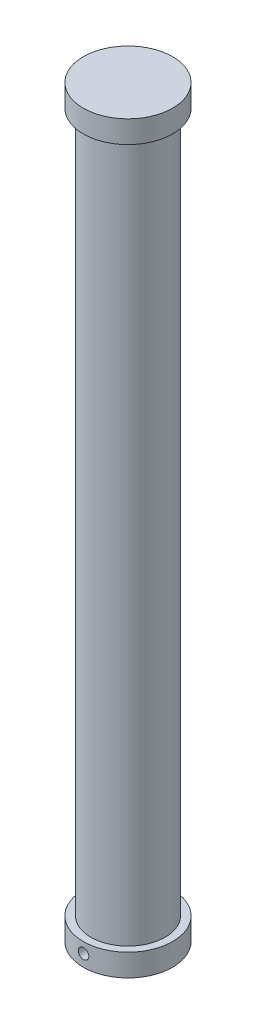
ISO-10303-21;
HEADER;
FILE_DESCRIPTION(('STEP AP214'),'2;1');
FILE_NAME('part.step','',(''),(''),'','','');
FILE_SCHEMA(('AUTOMOTIVE_DESIGN { 1 0 10303 214 1 1 1 1 }'));
ENDSEC;
DATA;
#1=APPLICATION_CONTEXT('core data for automotive mechanical design processes');
#2=APPLICATION_PROTOCOL_DEFINITION('international standard','automotive_design',2000,#1);
#3=PRODUCT_CONTEXT('',#1,'mechanical');
#4=PRODUCT('Part','Part','',(#3));
#5=PRODUCT_RELATED_PRODUCT_CATEGORY('part','',(#4));
#6=PRODUCT_DEFINITION_FORMATION('','',#4);
#7=PRODUCT_DEFINITION_CONTEXT('part definition',#1,'design');
#8=PRODUCT_DEFINITION('design','',#6,#7);
#9=PRODUCT_DEFINITION_SHAPE('','',#8);
#10=(LENGTH_UNIT() NAMED_UNIT(*) SI_UNIT(.MILLI.,.METRE.));
#11=(NAMED_UNIT(*) PLANE_ANGLE_UNIT() SI_UNIT($,.RADIAN.));
#12=(NAMED_UNIT(*) SI_UNIT($,.STERADIAN.) SOLID_ANGLE_UNIT());
#13=UNCERTAINTY_MEASURE_WITH_UNIT(LENGTH_MEASURE(1.E-05),#10,'distance_accuracy_value','');
#14=(GEOMETRIC_REPRESENTATION_CONTEXT(3) GLOBAL_UNCERTAINTY_ASSIGNED_CONTEXT((#13)) GLOBAL_UNIT_ASSIGNED_CONTEXT((#10,
#11,#12)) REPRESENTATION_CONTEXT('',''));
#15=CARTESIAN_POINT('',(0.,0.,0.));
#16=DIRECTION('',(0.,0.,1.));
#17=DIRECTION('',(1.,0.,0.));
#18=AXIS2_PLACEMENT_3D('',#15,#16,#17);
#19=CARTESIAN_POINT('',(0.,50.,0.));
#20=DIRECTION('',(0.,1.,0.));
#21=DIRECTION('',(-1.,0.,0.));
#22=AXIS2_PLACEMENT_3D('',#19,#20,#21);
#23=CYLINDRICAL_SURFACE('',#22,3.);
#24=CARTESIAN_POINT('',(0.,1.5,0.));
#25=DIRECTION('',(0.,1.,0.));
#26=DIRECTION('',(-1.,0.,0.));
#27=AXIS2_PLACEMENT_3D('',#24,#25,#26);
#28=CIRCLE('',#27,3.);
#29=CARTESIAN_POINT('',(-3.,1.5,0.));
#30=VERTEX_POINT('',#29);
#31=EDGE_CURVE('E47',#30,#30,#28,.T.);
#32=ORIENTED_EDGE('',*,*,#31,.F.);
#33=EDGE_LOOP('',(#32));
#34=FACE_BOUND('',#33,.T.);
#35=CARTESIAN_POINT('',(0.,0.,0.));
#36=DIRECTION('',(0.,1.,0.));
#37=DIRECTION('',(-1.,0.,0.));
#38=AXIS2_PLACEMENT_3D('',#35,#36,#37);
#39=CIRCLE('',#38,3.);
#40=CARTESIAN_POINT('',(-3.,0.,0.));
#41=VERTEX_POINT('',#40);
#42=EDGE_CURVE('E10',#41,#41,#39,.T.);
#43=ORIENTED_EDGE('',*,*,#42,.T.);
#44=EDGE_LOOP('',(#43));
#45=FACE_BOUND('',#44,.T.);
#46=CARTESIAN_POINT('',(-0.35,0.802923522551414,-2.97951338308792));
#47=CARTESIAN_POINT('',(-0.349999161223445,0.822511265245883,-2.97951364773673));
#48=CARTESIAN_POINT('',(-0.348350113747884,0.842111504549914,-2.97970862625163));
#49=CARTESIAN_POINT('',(-0.341797393838866,0.880767241574152,-2.98046724537003));
#50=CARTESIAN_POINT('',(-0.336890253973869,0.899822136349489,-2.98103127873162));
#51=CARTESIAN_POINT('',(-0.32396734183745,0.936821872343707,-2.9824632704724));
#52=CARTESIAN_POINT('',(-0.315953598732255,0.954767429304936,-2.98333103042808));
#53=CARTESIAN_POINT('',(-0.297049153620366,0.989055392431769,-2.98527245998851));
#54=CARTESIAN_POINT('',(-0.286158971804845,1.0053980877357,-2.98634609235253));
#55=CARTESIAN_POINT('',(-0.261753638808667,1.03609993948238,-2.98858418089488));
#56=CARTESIAN_POINT('',(-0.248227234592529,1.0504501242645,-2.98974901314468));
#57=CARTESIAN_POINT('',(-0.218957598403572,1.07668218997642,-2.99203486226237));
#58=CARTESIAN_POINT('',(-0.203214259440149,1.0885639517101,-2.99315587701226));
#59=CARTESIAN_POINT('',(-0.169901694948282,1.1095537136471,-2.99523159244975));
#60=CARTESIAN_POINT('',(-0.152327355232392,1.11865364944094,-2.99618580622701));
#61=CARTESIAN_POINT('',(-0.115886983849122,1.13376981675468,-2.99781628489831));
#62=CARTESIAN_POINT('',(-0.0970209942369041,1.13978614862036,-2.99849255883684));
#63=CARTESIAN_POINT('',(-0.0586243024747181,1.14853767246088,-2.99948831400881));
#64=CARTESIAN_POINT('',(-0.0390970309315914,1.15128772918662,-2.99980941118195));
#65=CARTESIAN_POINT('',(0.000144327639085537,1.15347468054051,-3.00006414472858));
#66=CARTESIAN_POINT('',(0.0198584081886424,1.15291168963881,-2.99999779448888));
#67=CARTESIAN_POINT('',(0.0588127205606732,1.14850049431022,-2.99948642176044));
#68=CARTESIAN_POINT('',(0.078054790174137,1.14466827543935,-2.99904324189153));
#69=CARTESIAN_POINT('',(0.115620799572831,1.13385236505493,-2.99783009060348));
#70=CARTESIAN_POINT('',(0.133944723826639,1.12686862024989,-2.99706011365831));
#71=CARTESIAN_POINT('',(0.169204104429469,1.10993071315375,-2.99527672528236));
#72=CARTESIAN_POINT('',(0.186136180813597,1.09996957733615,-2.99426274345197));
#73=CARTESIAN_POINT('',(0.218094351884489,1.0773647173508,-2.99210490952607));
#74=CARTESIAN_POINT('',(0.233120370366558,1.06472088598216,-2.99096105224158));
#75=CARTESIAN_POINT('',(0.260933706419429,1.03701988016374,-2.98866356651889));
#76=CARTESIAN_POINT('',(0.273707160059187,1.02194878299298,-2.98750992045636));
#77=CARTESIAN_POINT('',(0.296545173750231,0.989869044044865,-2.98532962837825));
#78=CARTESIAN_POINT('',(0.30660972716092,0.97286039751794,-2.984302982674));
#79=CARTESIAN_POINT('',(0.323744728388877,0.937376628363879,-2.98249291300022));
#80=CARTESIAN_POINT('',(0.330814156749145,0.918901008956771,-2.98170957186894));
#81=CARTESIAN_POINT('',(0.341746413810154,0.881013753533747,-2.9804764600808));
#82=CARTESIAN_POINT('',(0.34560937652905,0.861602156674039,-2.98002667548262));
#83=CARTESIAN_POINT('',(0.350000875403439,0.822516152158018,-2.97951411022731));
#84=CARTESIAN_POINT('',(0.3505488810829,0.802843960474129,-2.97944906992621));
#85=CARTESIAN_POINT('',(0.34834619521672,0.763688045208938,-2.97970738657806));
#86=CARTESIAN_POINT('',(0.345595564717283,0.744204318146542,-2.98003073634326));
#87=CARTESIAN_POINT('',(0.336890043016935,0.706036177170415,-2.98102734060544));
#88=CARTESIAN_POINT('',(0.330944499968318,0.687349602147369,-2.98169957409112));
#89=CARTESIAN_POINT('',(0.316027519482387,0.651238755445137,-2.98331737529937));
#90=CARTESIAN_POINT('',(0.307055988799645,0.63381452268497,-2.98426295144483));
#91=CARTESIAN_POINT('',(0.286293509804678,0.600634648660672,-2.98632633027885));
#92=CARTESIAN_POINT('',(0.274489745840013,0.584887075787833,-2.98744490736213));
#93=CARTESIAN_POINT('',(0.248416071978394,0.555589680519816,-2.98972578669665));
#94=CARTESIAN_POINT('',(0.234146078719241,0.542039932444388,-2.99088809042489));
#95=CARTESIAN_POINT('',(0.203460176847881,0.517454868917279,-2.99313236127279));
#96=CARTESIAN_POINT('',(0.187034009095524,0.506432314087539,-2.99421390286487));
#97=CARTESIAN_POINT('',(0.152552205539145,0.487302647462873,-2.99616848918425));
#98=CARTESIAN_POINT('',(0.134496598913617,0.47919548347476,-2.99704153764403));
#99=CARTESIAN_POINT('',(0.0973116154809955,0.4661480006956,-2.99847886971759));
#100=CARTESIAN_POINT('',(0.0781848972498101,0.46120018876961,-2.99904388343781));
#101=CARTESIAN_POINT('',(0.0393651847196159,0.454587454374519,-2.99980450423336));
#102=CARTESIAN_POINT('',(0.0196722125336349,0.452922403885057,-3.00000012571416));
#103=CARTESIAN_POINT('',(-0.0195961394516416,0.452924635764175,-2.99999987489361));
#104=CARTESIAN_POINT('',(-0.0391715233378456,0.454572194990443,-2.99980631973382));
#105=CARTESIAN_POINT('',(-0.0777652537998503,0.461111253453813,-2.99905405455136));
#106=CARTESIAN_POINT('',(-0.0967836004336522,0.466002752353142,-2.99849534456673));
#107=CARTESIAN_POINT('',(-0.133721665576691,0.478884897358325,-2.99707529734934));
#108=CARTESIAN_POINT('',(-0.15164167203335,0.486874727127817,-2.99621403983627));
#109=CARTESIAN_POINT('',(-0.185889569912979,0.505724683890308,-2.9942844920793));
#110=CARTESIAN_POINT('',(-0.202217452374167,0.516584827038513,-2.99321620067014));
#111=CARTESIAN_POINT('',(-0.232918528861254,0.540940514692901,-2.9909843884025));
#112=CARTESIAN_POINT('',(-0.247280031018242,0.554450751193688,-2.98982035868271));
#113=CARTESIAN_POINT('',(-0.27354008300556,0.583692959704031,-2.98753243407508));
#114=CARTESIAN_POINT('',(-0.285438046216235,0.599425459383666,-2.98640854879906));
#115=CARTESIAN_POINT('',(-0.306466883718857,0.632725774617497,-2.9843241162639));
#116=CARTESIAN_POINT('',(-0.315588277683846,0.650299608728324,-2.98336413342509));
#117=CARTESIAN_POINT('',(-0.330737816927518,0.686730433917195,-2.98172283839803));
#118=CARTESIAN_POINT('',(-0.336769371254114,0.705585984725701,-2.98104121925781));
#119=CARTESIAN_POINT('',(-0.344102374273725,0.737606032663178,-2.9802016331342));
#120=CARTESIAN_POINT('',(-0.346310860792777,0.750567511298079,-2.97994480127126));
#121=CARTESIAN_POINT('',(-0.349259950284348,0.776658628330768,-2.97960058804514));
#122=CARTESIAN_POINT('',(-0.350000562471424,0.789788265672422,-2.97951320561825));
#123=CARTESIAN_POINT('',(-0.35,0.802923522551414,-2.97951338308792));
#124=B_SPLINE_CURVE_WITH_KNOTS('',3,(#46,#47,#48,#49,#50,#51,#52,#53,#54,#55,#56,#57,#58,#59,
#60,#61,#62,#63,#64,#65,#66,#67,#68,#69,#70,#71,#72,#73,#74,#75,#76,#77,#78,#79,#80,#81,#82,#83,
#84,#85,#86,#87,#88,#89,#90,#91,#92,#93,#94,#95,#96,#97,#98,#99,#100,#101,#102,#103,#104,#105,
#106,#107,#108,#109,#110,#111,#112,#113,#114,#115,#116,#117,#118,#119,#120,#121,#122,#123),
.UNSPECIFIED.,.T.,.F.,(4,2,2,2,2,2,2,2,2,2,2,2,2,2,2,2,2,2,2,2,2,2,2,2,2,2,2,2,2,2,2,2,2,2,2,2,
2,2,4),(0.,0.0587152493703068,0.117493086943228,0.17623259661377,0.234961490769293,
0.293946795448501,0.352934947770214,0.412092517407894,0.471248161834173,0.530133545789995,
0.589016895190498,0.647613961990353,0.706212019688542,0.764948413445981,0.823687154760208,
0.882775675902613,0.941864341893256,1.00097310389078,1.06007939524087,1.11883820170337,
1.1775959207629,1.23618264644775,1.29477117764011,1.35362999037985,1.41249079302379,
1.47164256055315,1.53079326905711,1.58980316170827,1.64881075305993,1.70746805603357,
1.76612535289952,1.82476720545446,1.8834093880749,1.94238636941037,2.00137737827701,
2.0605676035464,2.11969238229147,2.15906622626694,2.198439823073),.UNSPECIFIED.);
#125=CARTESIAN_POINT('',(-0.35,0.802923522551414,-2.97951338308792));
#126=VERTEX_POINT('',#125);
#127=EDGE_CURVE('E55',#126,#126,#124,.T.);
#128=ORIENTED_EDGE('',*,*,#127,.F.);
#129=EDGE_LOOP('',(#128));
#130=FACE_BOUND('',#129,.T.);
#131=CARTESIAN_POINT('',(-0.35,0.802923522551414,2.97951338308792));
#132=CARTESIAN_POINT('',(-0.349999161223445,0.783335779856945,2.97951364773673));
#133=CARTESIAN_POINT('',(-0.348350113747885,0.763735540552914,2.97970862625163));
#134=CARTESIAN_POINT('',(-0.341797393838866,0.725079803528676,2.98046724537003));
#135=CARTESIAN_POINT('',(-0.336890253973869,0.706024908753339,2.98103127873162));
#136=CARTESIAN_POINT('',(-0.323967341837449,0.669025172759121,2.9824632704724));
#137=CARTESIAN_POINT('',(-0.315953598732255,0.651079615797892,2.98333103042808));
#138=CARTESIAN_POINT('',(-0.297049153620366,0.616791652671059,2.98527245998851));
#139=CARTESIAN_POINT('',(-0.286158971804845,0.600448957367127,2.98634609235253));
#140=CARTESIAN_POINT('',(-0.261753638808667,0.569747105620448,2.98858418089488));
#141=CARTESIAN_POINT('',(-0.248227234592529,0.555396920838329,2.98974901314468));
#142=CARTESIAN_POINT('',(-0.218957598403572,0.529164855126409,2.99203486226237));
#143=CARTESIAN_POINT('',(-0.203214259440149,0.517283093392732,2.99315587701226));
#144=CARTESIAN_POINT('',(-0.169901694948282,0.49629333145573,2.99523159244975));
#145=CARTESIAN_POINT('',(-0.152327355232392,0.487193395661892,2.99618580622701));
#146=CARTESIAN_POINT('',(-0.115886983849122,0.47207722834815,2.99781628489831));
#147=CARTESIAN_POINT('',(-0.0970209942369042,0.466060896482467,2.99849255883684));
#148=CARTESIAN_POINT('',(-0.0586243024747181,0.457309372641943,2.99948831400881));
#149=CARTESIAN_POINT('',(-0.0390970309315915,0.454559315916204,2.99980941118195));
#150=CARTESIAN_POINT('',(0.00014432763908548,0.452372364562314,3.00006414472858));
#151=CARTESIAN_POINT('',(0.0198584081886424,0.452935355464021,2.99999779448888));
#152=CARTESIAN_POINT('',(0.0588127205606732,0.457346550792605,2.99948642176044));
#153=CARTESIAN_POINT('',(0.0780547901741371,0.461178769663479,2.99904324189153));
#154=CARTESIAN_POINT('',(0.115620799572831,0.471994680047903,2.99783009060348));
#155=CARTESIAN_POINT('',(0.133944723826639,0.478978424852939,2.99706011365831));
#156=CARTESIAN_POINT('',(0.169204104429469,0.495916331949074,2.99527672528236));
#157=CARTESIAN_POINT('',(0.186136180813597,0.505877467766676,2.99426274345197));
#158=CARTESIAN_POINT('',(0.218094351884489,0.528482327752029,2.99210490952607));
#159=CARTESIAN_POINT('',(0.233120370366558,0.541126159120673,2.99096105224158));
#160=CARTESIAN_POINT('',(0.260933706419429,0.568827164939088,2.98866356651889));
#161=CARTESIAN_POINT('',(0.273707160059187,0.583898262109843,2.98750992045636));
#162=CARTESIAN_POINT('',(0.296545173750231,0.615978001057963,2.98532962837825));
#163=CARTESIAN_POINT('',(0.30660972716092,0.632986647584888,2.984302982674));
#164=CARTESIAN_POINT('',(0.323744728388877,0.668470416738949,2.98249291300022));
#165=CARTESIAN_POINT('',(0.330814156749145,0.686946036146057,2.98170957186894));
#166=CARTESIAN_POINT('',(0.341746413810154,0.724833291569081,2.9804764600808));
#167=CARTESIAN_POINT('',(0.34560937652905,0.744244888428789,2.98002667548262));
#168=CARTESIAN_POINT('',(0.350000875403439,0.783330892944811,2.97951411022731));
#169=CARTESIAN_POINT('',(0.3505488810829,0.803003084628699,2.97944906992621));
#170=CARTESIAN_POINT('',(0.34834619521672,0.84215899989389,2.97970738657806));
#171=CARTESIAN_POINT('',(0.345595564717283,0.861642726956286,2.98003073634326));
#172=CARTESIAN_POINT('',(0.336890043016935,0.899810867932414,2.98102734060544));
#173=CARTESIAN_POINT('',(0.330944499968318,0.91849744295546,2.98169957409112));
#174=CARTESIAN_POINT('',(0.316027519482387,0.954608289657692,2.98331737529937));
#175=CARTESIAN_POINT('',(0.307055988799645,0.972032522417858,2.98426295144483));
#176=CARTESIAN_POINT('',(0.286293509804678,1.00521239644216,2.98632633027885));
#177=CARTESIAN_POINT('',(0.274489745840013,1.02095996931499,2.98744490736213));
#178=CARTESIAN_POINT('',(0.248416071978394,1.05025736458301,2.98972578669665));
#179=CARTESIAN_POINT('',(0.234146078719241,1.06380711265844,2.99088809042489));
#180=CARTESIAN_POINT('',(0.203460176847881,1.08839217618555,2.99313236127279));
#181=CARTESIAN_POINT('',(0.187034009095524,1.09941473101529,2.99421390286487));
#182=CARTESIAN_POINT('',(0.152552205539145,1.11854439763996,2.99616848918425));
#183=CARTESIAN_POINT('',(0.134496598913617,1.12665156162807,2.99704153764403));
#184=CARTESIAN_POINT('',(0.0973116154809953,1.13969904440723,2.99847886971759));
#185=CARTESIAN_POINT('',(0.0781848972498099,1.14464685633322,2.99904388343781));
#186=CARTESIAN_POINT('',(0.0393651847196156,1.15125959072831,2.99980450423336));
#187=CARTESIAN_POINT('',(0.0196722125336347,1.15292464121777,3.00000012571416));
#188=CARTESIAN_POINT('',(-0.0195961394516417,1.15292240933865,2.99999987489361));
#189=CARTESIAN_POINT('',(-0.0391715233378457,1.15127485011239,2.99980631973382));
#190=CARTESIAN_POINT('',(-0.0777652537998505,1.14473579164902,2.99905405455136));
#191=CARTESIAN_POINT('',(-0.0967836004336523,1.13984429274969,2.99849534456673));
#192=CARTESIAN_POINT('',(-0.133721665576691,1.1269621477445,2.99707529734934));
#193=CARTESIAN_POINT('',(-0.15164167203335,1.11897231797501,2.99621403983627));
#194=CARTESIAN_POINT('',(-0.185889569912979,1.10012236121252,2.9942844920793));
#195=CARTESIAN_POINT('',(-0.202217452374167,1.08926221806431,2.99321620067014));
#196=CARTESIAN_POINT('',(-0.232918528861254,1.06490653040993,2.9909843884025));
#197=CARTESIAN_POINT('',(-0.247280031018242,1.05139629390914,2.98982035868271));
#198=CARTESIAN_POINT('',(-0.27354008300556,1.0221540853988,2.98753243407508));
#199=CARTESIAN_POINT('',(-0.285438046216235,1.00642158571916,2.98640854879906));
#200=CARTESIAN_POINT('',(-0.306466883718857,0.973121270485331,2.9843241162639));
#201=CARTESIAN_POINT('',(-0.315588277683846,0.955547436374504,2.98336413342509));
#202=CARTESIAN_POINT('',(-0.330737816927518,0.919116611185633,2.98172283839803));
#203=CARTESIAN_POINT('',(-0.336769371254114,0.900261060377127,2.98104121925781));
#204=CARTESIAN_POINT('',(-0.344102374273725,0.86824101243965,2.9802016331342));
#205=CARTESIAN_POINT('',(-0.346310860792777,0.855279533804749,2.97994480127126));
#206=CARTESIAN_POINT('',(-0.349259950284348,0.82918841677206,2.97960058804514));
#207=CARTESIAN_POINT('',(-0.350000562471424,0.816058779430406,2.97951320561825));
#208=CARTESIAN_POINT('',(-0.35,0.802923522551414,2.97951338308792));
#209=B_SPLINE_CURVE_WITH_KNOTS('',3,(#131,#132,#133,#134,#135,#136,#137,#138,#139,#140,#141,
#142,#143,#144,#145,#146,#147,#148,#149,#150,#151,#152,#153,#154,#155,#156,#157,#158,#159,#160,
#161,#162,#163,#164,#165,#166,#167,#168,#169,#170,#171,#172,#173,#174,#175,#176,#177,#178,#179,
#180,#181,#182,#183,#184,#185,#186,#187,#188,#189,#190,#191,#192,#193,#194,#195,#196,#197,#198,
#199,#200,#201,#202,#203,#204,#205,#206,#207,#208),.UNSPECIFIED.,.T.,.F.,(4,2,2,2,2,2,2,2,2,2,2,
2,2,2,2,2,2,2,2,2,2,2,2,2,2,2,2,2,2,2,2,2,2,2,2,2,2,2,4),(0.,0.0587152493703068,
0.117493086943228,0.17623259661377,0.234961490769293,0.293946795448501,0.352934947770214,
0.412092517407894,0.471248161834173,0.530133545789995,0.589016895190498,0.647613961990353,
0.706212019688542,0.764948413445981,0.823687154760207,0.882775675902613,0.941864341893256,
1.00097310389077,1.06007939524087,1.11883820170337,1.1775959207629,1.23618264644775,
1.29477117764011,1.35362999037985,1.41249079302379,1.47164256055315,1.53079326905711,
1.58980316170827,1.64881075305993,1.70746805603357,1.76612535289952,1.82476720545446,
1.8834093880749,1.94238636941037,2.00137737827701,2.0605676035464,2.11969238229147,
2.15906622626694,2.198439823073),.UNSPECIFIED.);
#210=CARTESIAN_POINT('',(-0.35,0.802923522551414,2.97951338308792));
#211=VERTEX_POINT('',#210);
#212=EDGE_CURVE('E39',#211,#211,#209,.T.);
#213=ORIENTED_EDGE('',*,*,#212,.F.);
#214=EDGE_LOOP('',(#213));
#215=FACE_BOUND('',#214,.T.);
#216=ADVANCED_FACE('F35',(#34,#45,#130,#215),#23,.T.);
#217=CARTESIAN_POINT('',(0.,0.,0.));
#218=DIRECTION('',(0.,1.,0.));
#219=DIRECTION('',(-1.,0.,0.));
#220=AXIS2_PLACEMENT_3D('',#217,#218,#219);
#221=PLANE('',#220);
#222=ORIENTED_EDGE('',*,*,#42,.F.);
#223=EDGE_LOOP('',(#222));
#224=FACE_BOUND('',#223,.T.);
#225=ADVANCED_FACE('F37',(#224),#221,.F.);
#226=CARTESIAN_POINT('',(3.,1.5,0.));
#227=DIRECTION('',(0.,-1.,0.));
#228=DIRECTION('',(1.,0.,0.));
#229=AXIS2_PLACEMENT_3D('',#226,#227,#228);
#230=PLANE('',#229);
#231=CARTESIAN_POINT('',(0.,1.5,0.));
#232=DIRECTION('',(0.,1.,0.));
#233=DIRECTION('',(-1.,0.,0.));
#234=AXIS2_PLACEMENT_3D('',#231,#232,#233);
#235=CIRCLE('',#234,2.5);
#236=CARTESIAN_POINT('',(-2.5,1.5,0.));
#237=VERTEX_POINT('',#236);
#238=EDGE_CURVE('E52',#237,#237,#235,.T.);
#239=ORIENTED_EDGE('',*,*,#238,.F.);
#240=EDGE_LOOP('',(#239));
#241=FACE_BOUND('',#240,.T.);
#242=ORIENTED_EDGE('',*,*,#31,.T.);
#243=EDGE_LOOP('',(#242));
#244=FACE_BOUND('',#243,.T.);
#245=ADVANCED_FACE('F82',(#241,#244),#230,.F.);
#246=CARTESIAN_POINT('',(0.,50.,0.));
#247=DIRECTION('',(0.,1.,0.));
#248=DIRECTION('',(-1.,0.,0.));
#249=AXIS2_PLACEMENT_3D('',#246,#247,#248);
#250=CYLINDRICAL_SURFACE('',#249,2.50000000000001);
#251=CARTESIAN_POINT('',(0.,48.5,0.));
#252=DIRECTION('',(0.,1.,0.));
#253=DIRECTION('',(-1.,0.,0.));
#254=AXIS2_PLACEMENT_3D('',#251,#252,#253);
#255=CIRCLE('',#254,2.50000000000001);
#256=CARTESIAN_POINT('',(-2.5,48.5,0.));
#257=VERTEX_POINT('',#256);
#258=EDGE_CURVE('E109',#257,#257,#255,.T.);
#259=ORIENTED_EDGE('',*,*,#258,.F.);
#260=EDGE_LOOP('',(#259));
#261=FACE_BOUND('',#260,.T.);
#262=ORIENTED_EDGE('',*,*,#238,.T.);
#263=EDGE_LOOP('',(#262));
#264=FACE_BOUND('',#263,.T.);
#265=ADVANCED_FACE('F79',(#261,#264),#250,.T.);
#266=CARTESIAN_POINT('',(2.50000000000001,48.5,0.));
#267=DIRECTION('',(0.,1.,0.));
#268=DIRECTION('',(-1.,0.,0.));
#269=AXIS2_PLACEMENT_3D('',#266,#267,#268);
#270=PLANE('',#269);
#271=CARTESIAN_POINT('',(0.,48.5,0.));
#272=DIRECTION('',(0.,1.,0.));
#273=DIRECTION('',(-1.,0.,0.));
#274=AXIS2_PLACEMENT_3D('',#271,#272,#273);
#275=CIRCLE('',#274,3.);
#276=CARTESIAN_POINT('',(-3.,48.5,0.));
#277=VERTEX_POINT('',#276);
#278=EDGE_CURVE('E105',#277,#277,#275,.T.);
#279=ORIENTED_EDGE('',*,*,#278,.F.);
#280=EDGE_LOOP('',(#279));
#281=FACE_BOUND('',#280,.T.);
#282=ORIENTED_EDGE('',*,*,#258,.T.);
#283=EDGE_LOOP('',(#282));
#284=FACE_BOUND('',#283,.T.);
#285=ADVANCED_FACE('F75',(#281,#284),#270,.F.);
#286=CARTESIAN_POINT('',(0.,50.,0.));
#287=DIRECTION('',(0.,1.,0.));
#288=DIRECTION('',(-1.,0.,0.));
#289=AXIS2_PLACEMENT_3D('',#286,#287,#288);
#290=CYLINDRICAL_SURFACE('',#289,3.);
#291=CARTESIAN_POINT('',(0.,50.,0.));
#292=DIRECTION('',(0.,1.,0.));
#293=DIRECTION('',(-1.,0.,0.));
#294=AXIS2_PLACEMENT_3D('',#291,#292,#293);
#295=CIRCLE('',#294,3.);
#296=CARTESIAN_POINT('',(-3.,50.,0.));
#297=VERTEX_POINT('',#296);
#298=EDGE_CURVE('E103',#297,#297,#295,.T.);
#299=ORIENTED_EDGE('',*,*,#298,.F.);
#300=EDGE_LOOP('',(#299));
#301=FACE_BOUND('',#300,.T.);
#302=ORIENTED_EDGE('',*,*,#278,.T.);
#303=EDGE_LOOP('',(#302));
#304=FACE_BOUND('',#303,.T.);
#305=ADVANCED_FACE('F71',(#301,#304),#290,.T.);
#306=CARTESIAN_POINT('',(3.,50.,0.));
#307=DIRECTION('',(0.,-1.,0.));
#308=DIRECTION('',(1.,0.,0.));
#309=AXIS2_PLACEMENT_3D('',#306,#307,#308);
#310=PLANE('',#309);
#311=ORIENTED_EDGE('',*,*,#298,.T.);
#312=EDGE_LOOP('',(#311));
#313=FACE_BOUND('',#312,.T.);
#314=ADVANCED_FACE('F66',(#313),#310,.F.);
#315=CARTESIAN_POINT('',(0.,0.802923522551414,5.));
#316=DIRECTION('',(0.,0.,-1.));
#317=DIRECTION('',(-1.,0.,0.));
#318=AXIS2_PLACEMENT_3D('',#315,#316,#317);
#319=CYLINDRICAL_SURFACE('',#318,0.35);
#320=ORIENTED_EDGE('',*,*,#127,.T.);
#321=EDGE_LOOP('',(#320));
#322=FACE_BOUND('',#321,.T.);
#323=ORIENTED_EDGE('',*,*,#212,.T.);
#324=EDGE_LOOP('',(#323));
#325=FACE_BOUND('',#324,.T.);
#326=ADVANCED_FACE('F62',(#322,#325),#319,.F.);
#327=CLOSED_SHELL('',(#216,#225,#245,#265,#285,#305,#314,#326));
#328=MANIFOLD_SOLID_BREP('B2',#327);
#329=ADVANCED_BREP_SHAPE_REPRESENTATION('',(#18,#328),#14);
#330=SHAPE_DEFINITION_REPRESENTATION(#9,#329);
ENDSEC;
END-ISO-10303-21;
